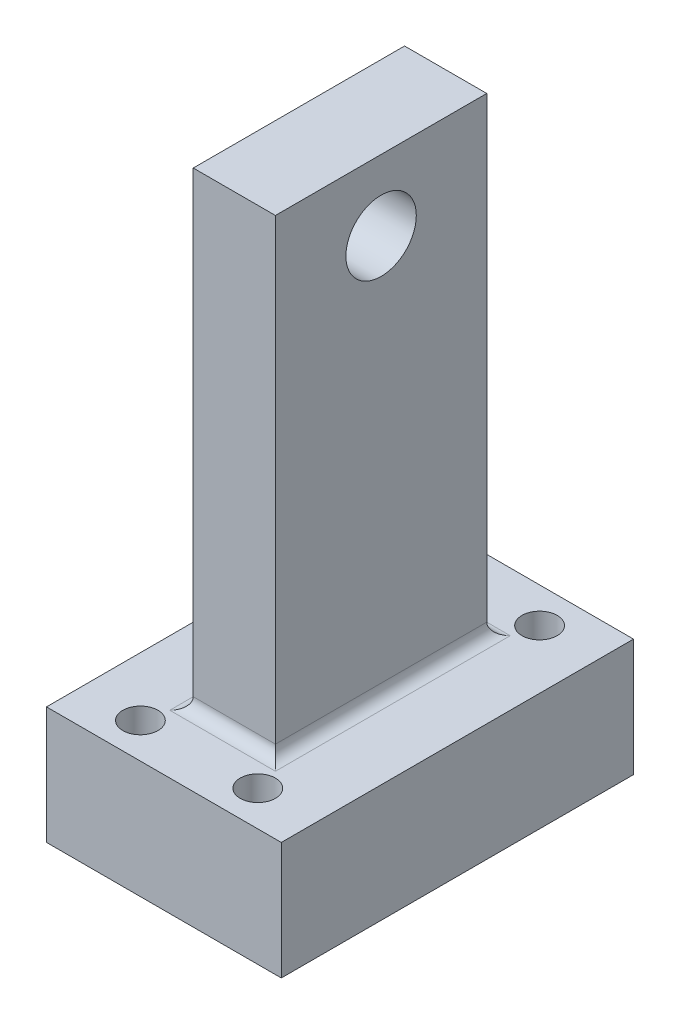
ISO-10303-21;
HEADER;
FILE_DESCRIPTION(('STEP AP214'),'2;1');
FILE_NAME('part.step','',(''),(''),'','','');
FILE_SCHEMA(('AUTOMOTIVE_DESIGN { 1 0 10303 214 1 1 1 1 }'));
ENDSEC;
DATA;
#1=APPLICATION_CONTEXT('core data for automotive mechanical design processes');
#2=APPLICATION_PROTOCOL_DEFINITION('international standard','automotive_design',2000,#1);
#3=PRODUCT_CONTEXT('',#1,'mechanical');
#4=PRODUCT('Part','Part','',(#3));
#5=PRODUCT_RELATED_PRODUCT_CATEGORY('part','',(#4));
#6=PRODUCT_DEFINITION_FORMATION('','',#4);
#7=PRODUCT_DEFINITION_CONTEXT('part definition',#1,'design');
#8=PRODUCT_DEFINITION('design','',#6,#7);
#9=PRODUCT_DEFINITION_SHAPE('','',#8);
#10=(LENGTH_UNIT() NAMED_UNIT(*) SI_UNIT(.MILLI.,.METRE.));
#11=(NAMED_UNIT(*) PLANE_ANGLE_UNIT() SI_UNIT($,.RADIAN.));
#12=(NAMED_UNIT(*) SI_UNIT($,.STERADIAN.) SOLID_ANGLE_UNIT());
#13=UNCERTAINTY_MEASURE_WITH_UNIT(LENGTH_MEASURE(1.E-05),#10,'distance_accuracy_value','');
#14=(GEOMETRIC_REPRESENTATION_CONTEXT(3) GLOBAL_UNCERTAINTY_ASSIGNED_CONTEXT((#13)) GLOBAL_UNIT_ASSIGNED_CONTEXT((#10,
#11,#12)) REPRESENTATION_CONTEXT('',''));
#15=CARTESIAN_POINT('',(0.,0.,0.));
#16=DIRECTION('',(0.,0.,1.));
#17=DIRECTION('',(1.,0.,0.));
#18=AXIS2_PLACEMENT_3D('',#15,#16,#17);
#19=CARTESIAN_POINT('',(0.,10.,0.));
#20=DIRECTION('',(0.,0.,-1.));
#21=DIRECTION('',(-1.,0.,0.));
#22=AXIS2_PLACEMENT_3D('',#19,#20,#21);
#23=PLANE('',#22);
#24=DIRECTION('',(1.,0.,0.));
#25=VECTOR('',#24,1.);
#26=CARTESIAN_POINT('',(0.,0.,0.));
#27=LINE('',#26,#25);
#28=CARTESIAN_POINT('',(0.,0.,0.));
#29=VERTEX_POINT('',#28);
#30=CARTESIAN_POINT('',(20.,0.,0.));
#31=VERTEX_POINT('',#30);
#32=EDGE_CURVE('E185',#29,#31,#27,.T.);
#33=ORIENTED_EDGE('',*,*,#32,.T.);
#34=DIRECTION('',(0.,-1.,0.));
#35=VECTOR('',#34,1.);
#36=CARTESIAN_POINT('',(20.,10.,0.));
#37=LINE('',#36,#35);
#38=CARTESIAN_POINT('',(20.,10.,0.));
#39=VERTEX_POINT('',#38);
#40=EDGE_CURVE('E201',#39,#31,#37,.T.);
#41=ORIENTED_EDGE('',*,*,#40,.F.);
#42=DIRECTION('',(1.,0.,0.));
#43=VECTOR('',#42,1.);
#44=CARTESIAN_POINT('',(0.,10.,0.));
#45=LINE('',#44,#43);
#46=CARTESIAN_POINT('',(0.,10.,0.));
#47=VERTEX_POINT('',#46);
#48=EDGE_CURVE('E165',#47,#39,#45,.T.);
#49=ORIENTED_EDGE('',*,*,#48,.F.);
#50=DIRECTION('',(0.,-1.,0.));
#51=VECTOR('',#50,1.);
#52=CARTESIAN_POINT('',(0.,10.,0.));
#53=LINE('',#52,#51);
#54=EDGE_CURVE('E175',#47,#29,#53,.T.);
#55=ORIENTED_EDGE('',*,*,#54,.T.);
#56=EDGE_LOOP('',(#33,#41,#49,#55));
#57=FACE_BOUND('',#56,.T.);
#58=ADVANCED_FACE('F41',(#57),#23,.F.);
#59=CARTESIAN_POINT('',(20.,10.,0.));
#60=DIRECTION('',(-1.,0.,0.));
#61=DIRECTION('',(0.,0.,1.));
#62=AXIS2_PLACEMENT_3D('',#59,#60,#61);
#63=PLANE('',#62);
#64=DIRECTION('',(0.,0.,-1.));
#65=VECTOR('',#64,1.);
#66=CARTESIAN_POINT('',(20.,0.,0.));
#67=LINE('',#66,#65);
#68=CARTESIAN_POINT('',(20.,0.,-30.));
#69=VERTEX_POINT('',#68);
#70=EDGE_CURVE('E188',#31,#69,#67,.T.);
#71=ORIENTED_EDGE('',*,*,#70,.T.);
#72=DIRECTION('',(0.,-1.,0.));
#73=VECTOR('',#72,1.);
#74=CARTESIAN_POINT('',(20.,10.,-30.));
#75=LINE('',#74,#73);
#76=CARTESIAN_POINT('',(20.,10.,-30.));
#77=VERTEX_POINT('',#76);
#78=EDGE_CURVE('E199',#77,#69,#75,.T.);
#79=ORIENTED_EDGE('',*,*,#78,.F.);
#80=DIRECTION('',(0.,0.,-1.));
#81=VECTOR('',#80,1.);
#82=CARTESIAN_POINT('',(20.,10.,0.));
#83=LINE('',#82,#81);
#84=EDGE_CURVE('E168',#39,#77,#83,.T.);
#85=ORIENTED_EDGE('',*,*,#84,.F.);
#86=ORIENTED_EDGE('',*,*,#40,.T.);
#87=EDGE_LOOP('',(#71,#79,#85,#86));
#88=FACE_BOUND('',#87,.T.);
#89=ADVANCED_FACE('F260',(#88),#63,.F.);
#90=CARTESIAN_POINT('',(0.,10.,-30.));
#91=DIRECTION('',(0.,0.,-1.));
#92=DIRECTION('',(-1.,0.,0.));
#93=AXIS2_PLACEMENT_3D('',#90,#91,#92);
#94=PLANE('',#93);
#95=DIRECTION('',(1.,0.,0.));
#96=VECTOR('',#95,1.);
#97=CARTESIAN_POINT('',(0.,0.,-30.));
#98=LINE('',#97,#96);
#99=CARTESIAN_POINT('',(0.,0.,-30.));
#100=VERTEX_POINT('',#99);
#101=EDGE_CURVE('E191',#100,#69,#98,.T.);
#102=ORIENTED_EDGE('',*,*,#101,.F.);
#103=DIRECTION('',(0.,-1.,0.));
#104=VECTOR('',#103,1.);
#105=CARTESIAN_POINT('',(0.,10.,-30.));
#106=LINE('',#105,#104);
#107=CARTESIAN_POINT('',(0.,10.,-30.));
#108=VERTEX_POINT('',#107);
#109=EDGE_CURVE('E197',#108,#100,#106,.T.);
#110=ORIENTED_EDGE('',*,*,#109,.F.);
#111=DIRECTION('',(1.,0.,0.));
#112=VECTOR('',#111,1.);
#113=CARTESIAN_POINT('',(0.,10.,-30.));
#114=LINE('',#113,#112);
#115=EDGE_CURVE('E170',#108,#77,#114,.T.);
#116=ORIENTED_EDGE('',*,*,#115,.T.);
#117=ORIENTED_EDGE('',*,*,#78,.T.);
#118=EDGE_LOOP('',(#102,#110,#116,#117));
#119=FACE_BOUND('',#118,.T.);
#120=ADVANCED_FACE('F266',(#119),#94,.T.);
#121=CARTESIAN_POINT('',(5.,10.,-27.));
#122=DIRECTION('',(0.,-1.,0.));
#123=DIRECTION('',(0.,0.,-1.));
#124=AXIS2_PLACEMENT_3D('',#121,#122,#123);
#125=CYLINDRICAL_SURFACE('',#124,1.5);
#126=CARTESIAN_POINT('',(5.,10.,-27.));
#127=DIRECTION('',(0.,1.,0.));
#128=DIRECTION('',(0.,0.,1.));
#129=AXIS2_PLACEMENT_3D('',#126,#127,#128);
#130=CIRCLE('',#129,1.5);
#131=CARTESIAN_POINT('',(5.,10.,-25.5));
#132=VERTEX_POINT('',#131);
#133=EDGE_CURVE('E162',#132,#132,#130,.T.);
#134=ORIENTED_EDGE('',*,*,#133,.T.);
#135=EDGE_LOOP('',(#134));
#136=FACE_BOUND('',#135,.T.);
#137=CARTESIAN_POINT('',(5.,0.,-27.));
#138=DIRECTION('',(0.,1.,0.));
#139=DIRECTION('',(0.,0.,1.));
#140=AXIS2_PLACEMENT_3D('',#137,#138,#139);
#141=CIRCLE('',#140,1.5);
#142=CARTESIAN_POINT('',(5.,0.,-25.5));
#143=VERTEX_POINT('',#142);
#144=EDGE_CURVE('E182',#143,#143,#141,.T.);
#145=ORIENTED_EDGE('',*,*,#144,.F.);
#146=EDGE_LOOP('',(#145));
#147=FACE_BOUND('',#146,.T.);
#148=ADVANCED_FACE('F271',(#136,#147),#125,.F.);
#149=CARTESIAN_POINT('',(15.,10.,-27.));
#150=DIRECTION('',(0.,-1.,0.));
#151=DIRECTION('',(0.,0.,-1.));
#152=AXIS2_PLACEMENT_3D('',#149,#150,#151);
#153=CYLINDRICAL_SURFACE('',#152,1.5);
#154=CARTESIAN_POINT('',(15.,10.,-27.));
#155=DIRECTION('',(0.,1.,0.));
#156=DIRECTION('',(0.,0.,1.));
#157=AXIS2_PLACEMENT_3D('',#154,#155,#156);
#158=CIRCLE('',#157,1.5);
#159=CARTESIAN_POINT('',(15.,10.,-25.5));
#160=VERTEX_POINT('',#159);
#161=EDGE_CURVE('E159',#160,#160,#158,.T.);
#162=ORIENTED_EDGE('',*,*,#161,.T.);
#163=EDGE_LOOP('',(#162));
#164=FACE_BOUND('',#163,.T.);
#165=CARTESIAN_POINT('',(15.,0.,-27.));
#166=DIRECTION('',(0.,1.,0.));
#167=DIRECTION('',(0.,0.,1.));
#168=AXIS2_PLACEMENT_3D('',#165,#166,#167);
#169=CIRCLE('',#168,1.5);
#170=CARTESIAN_POINT('',(15.,0.,-25.5));
#171=VERTEX_POINT('',#170);
#172=EDGE_CURVE('E179',#171,#171,#169,.T.);
#173=ORIENTED_EDGE('',*,*,#172,.F.);
#174=EDGE_LOOP('',(#173));
#175=FACE_BOUND('',#174,.T.);
#176=ADVANCED_FACE('F274',(#164,#175),#153,.F.);
#177=CARTESIAN_POINT('',(5.,10.,-3.));
#178=DIRECTION('',(0.,-1.,0.));
#179=DIRECTION('',(0.,0.,-1.));
#180=AXIS2_PLACEMENT_3D('',#177,#178,#179);
#181=CYLINDRICAL_SURFACE('',#180,1.5);
#182=CARTESIAN_POINT('',(5.,10.,-3.));
#183=DIRECTION('',(0.,1.,0.));
#184=DIRECTION('',(0.,0.,1.));
#185=AXIS2_PLACEMENT_3D('',#182,#183,#184);
#186=CIRCLE('',#185,1.5);
#187=CARTESIAN_POINT('',(5.,10.,-1.5));
#188=VERTEX_POINT('',#187);
#189=EDGE_CURVE('E155',#188,#188,#186,.T.);
#190=ORIENTED_EDGE('',*,*,#189,.T.);
#191=EDGE_LOOP('',(#190));
#192=FACE_BOUND('',#191,.T.);
#193=CARTESIAN_POINT('',(5.,0.,-3.));
#194=DIRECTION('',(0.,1.,0.));
#195=DIRECTION('',(0.,0.,1.));
#196=AXIS2_PLACEMENT_3D('',#193,#194,#195);
#197=CIRCLE('',#196,1.5);
#198=CARTESIAN_POINT('',(5.,0.,-1.5));
#199=VERTEX_POINT('',#198);
#200=EDGE_CURVE('E146',#199,#199,#197,.T.);
#201=ORIENTED_EDGE('',*,*,#200,.F.);
#202=EDGE_LOOP('',(#201));
#203=FACE_BOUND('',#202,.T.);
#204=ADVANCED_FACE('F278',(#192,#203),#181,.F.);
#205=CARTESIAN_POINT('',(15.,10.,-3.));
#206=DIRECTION('',(0.,-1.,0.));
#207=DIRECTION('',(0.,0.,-1.));
#208=AXIS2_PLACEMENT_3D('',#205,#206,#207);
#209=CYLINDRICAL_SURFACE('',#208,1.5);
#210=CARTESIAN_POINT('',(15.,10.,-3.));
#211=DIRECTION('',(0.,1.,0.));
#212=DIRECTION('',(0.,0.,1.));
#213=AXIS2_PLACEMENT_3D('',#210,#211,#212);
#214=CIRCLE('',#213,1.5);
#215=CARTESIAN_POINT('',(15.,10.,-1.5));
#216=VERTEX_POINT('',#215);
#217=EDGE_CURVE('E152',#216,#216,#214,.T.);
#218=ORIENTED_EDGE('',*,*,#217,.T.);
#219=EDGE_LOOP('',(#218));
#220=FACE_BOUND('',#219,.T.);
#221=CARTESIAN_POINT('',(15.,0.,-3.));
#222=DIRECTION('',(0.,1.,0.));
#223=DIRECTION('',(0.,0.,1.));
#224=AXIS2_PLACEMENT_3D('',#221,#222,#223);
#225=CIRCLE('',#224,1.5);
#226=CARTESIAN_POINT('',(15.,0.,-1.5));
#227=VERTEX_POINT('',#226);
#228=EDGE_CURVE('E143',#227,#227,#225,.T.);
#229=ORIENTED_EDGE('',*,*,#228,.F.);
#230=EDGE_LOOP('',(#229));
#231=FACE_BOUND('',#230,.T.);
#232=ADVANCED_FACE('F282',(#220,#231),#209,.F.);
#233=CARTESIAN_POINT('',(0.,10.,0.));
#234=DIRECTION('',(-1.,0.,0.));
#235=DIRECTION('',(0.,0.,1.));
#236=AXIS2_PLACEMENT_3D('',#233,#234,#235);
#237=PLANE('',#236);
#238=DIRECTION('',(0.,0.,-1.));
#239=VECTOR('',#238,1.);
#240=CARTESIAN_POINT('',(0.,0.,0.));
#241=LINE('',#240,#239);
#242=EDGE_CURVE('E156',#29,#100,#241,.T.);
#243=ORIENTED_EDGE('',*,*,#242,.F.);
#244=ORIENTED_EDGE('',*,*,#54,.F.);
#245=DIRECTION('',(0.,0.,-1.));
#246=VECTOR('',#245,1.);
#247=CARTESIAN_POINT('',(0.,10.,0.));
#248=LINE('',#247,#246);
#249=EDGE_CURVE('E173',#47,#108,#248,.T.);
#250=ORIENTED_EDGE('',*,*,#249,.T.);
#251=ORIENTED_EDGE('',*,*,#109,.T.);
#252=EDGE_LOOP('',(#243,#244,#250,#251));
#253=FACE_BOUND('',#252,.T.);
#254=ADVANCED_FACE('F286',(#253),#237,.T.);
#255=CARTESIAN_POINT('',(0.,10.,0.));
#256=DIRECTION('',(0.,1.,0.));
#257=DIRECTION('',(0.,0.,1.));
#258=AXIS2_PLACEMENT_3D('',#255,#256,#257);
#259=PLANE('',#258);
#260=DIRECTION('',(0.,0.,1.));
#261=VECTOR('',#260,1.);
#262=CARTESIAN_POINT('',(5.5,10.,0.));
#263=LINE('',#262,#261);
#264=CARTESIAN_POINT('',(5.5,10.,-5.00000000000001));
#265=VERTEX_POINT('',#264);
#266=CARTESIAN_POINT('',(5.5,10.,-25.));
#267=VERTEX_POINT('',#266);
#268=EDGE_CURVE('E213',#265,#267,#263,.F.);
#269=ORIENTED_EDGE('',*,*,#268,.T.);
#270=DIRECTION('',(-1.,0.,0.));
#271=VECTOR('',#270,1.);
#272=CARTESIAN_POINT('',(0.,10.,-25.));
#273=LINE('',#272,#271);
#274=CARTESIAN_POINT('',(14.5,10.,-25.));
#275=VERTEX_POINT('',#274);
#276=EDGE_CURVE('E215',#267,#275,#273,.F.);
#277=ORIENTED_EDGE('',*,*,#276,.T.);
#278=DIRECTION('',(0.,0.,-1.));
#279=VECTOR('',#278,1.);
#280=CARTESIAN_POINT('',(14.5,10.,0.));
#281=LINE('',#280,#279);
#282=CARTESIAN_POINT('',(14.5,10.,-5.00000000000001));
#283=VERTEX_POINT('',#282);
#284=EDGE_CURVE('E211',#275,#283,#281,.F.);
#285=ORIENTED_EDGE('',*,*,#284,.T.);
#286=DIRECTION('',(1.,0.,0.));
#287=VECTOR('',#286,1.);
#288=CARTESIAN_POINT('',(0.,10.,-5.00000000000001));
#289=LINE('',#288,#287);
#290=EDGE_CURVE('E209',#283,#265,#289,.F.);
#291=ORIENTED_EDGE('',*,*,#290,.T.);
#292=EDGE_LOOP('',(#269,#277,#285,#291));
#293=FACE_BOUND('',#292,.T.);
#294=ORIENTED_EDGE('',*,*,#217,.F.);
#295=EDGE_LOOP('',(#294));
#296=FACE_BOUND('',#295,.T.);
#297=ORIENTED_EDGE('',*,*,#189,.F.);
#298=EDGE_LOOP('',(#297));
#299=FACE_BOUND('',#298,.T.);
#300=ORIENTED_EDGE('',*,*,#161,.F.);
#301=EDGE_LOOP('',(#300));
#302=FACE_BOUND('',#301,.T.);
#303=ORIENTED_EDGE('',*,*,#133,.F.);
#304=EDGE_LOOP('',(#303));
#305=FACE_BOUND('',#304,.T.);
#306=ORIENTED_EDGE('',*,*,#48,.T.);
#307=ORIENTED_EDGE('',*,*,#84,.T.);
#308=ORIENTED_EDGE('',*,*,#115,.F.);
#309=ORIENTED_EDGE('',*,*,#249,.F.);
#310=EDGE_LOOP('',(#306,#307,#308,#309));
#311=FACE_BOUND('',#310,.T.);
#312=ADVANCED_FACE('F384',(#293,#296,#299,#302,#305,#311),#259,.T.);
#313=CARTESIAN_POINT('',(0.,0.,0.));
#314=DIRECTION('',(0.,1.,0.));
#315=DIRECTION('',(0.,0.,1.));
#316=AXIS2_PLACEMENT_3D('',#313,#314,#315);
#317=PLANE('',#316);
#318=ORIENTED_EDGE('',*,*,#228,.T.);
#319=EDGE_LOOP('',(#318));
#320=FACE_BOUND('',#319,.T.);
#321=ORIENTED_EDGE('',*,*,#200,.T.);
#322=EDGE_LOOP('',(#321));
#323=FACE_BOUND('',#322,.T.);
#324=ORIENTED_EDGE('',*,*,#172,.T.);
#325=EDGE_LOOP('',(#324));
#326=FACE_BOUND('',#325,.T.);
#327=ORIENTED_EDGE('',*,*,#144,.T.);
#328=EDGE_LOOP('',(#327));
#329=FACE_BOUND('',#328,.T.);
#330=ORIENTED_EDGE('',*,*,#32,.F.);
#331=ORIENTED_EDGE('',*,*,#242,.T.);
#332=ORIENTED_EDGE('',*,*,#101,.T.);
#333=ORIENTED_EDGE('',*,*,#70,.F.);
#334=EDGE_LOOP('',(#330,#331,#332,#333));
#335=FACE_BOUND('',#334,.T.);
#336=ADVANCED_FACE('F374',(#320,#323,#326,#329,#335),#317,.F.);
#337=CARTESIAN_POINT('',(13.5,50.,-6.00000000000001));
#338=DIRECTION('',(-1.,0.,0.));
#339=DIRECTION('',(0.,0.,1.));
#340=AXIS2_PLACEMENT_3D('',#337,#338,#339);
#341=PLANE('',#340);
#342=CARTESIAN_POINT('',(13.5,44.,-15.));
#343=DIRECTION('',(1.,0.,0.));
#344=DIRECTION('',(0.,0.,-1.));
#345=AXIS2_PLACEMENT_3D('',#342,#343,#344);
#346=CIRCLE('',#345,3.);
#347=CARTESIAN_POINT('',(13.5,44.,-18.));
#348=VERTEX_POINT('',#347);
#349=EDGE_CURVE('E207',#348,#348,#346,.T.);
#350=ORIENTED_EDGE('',*,*,#349,.F.);
#351=EDGE_LOOP('',(#350));
#352=FACE_BOUND('',#351,.T.);
#353=DIRECTION('',(0.,-1.,0.));
#354=VECTOR('',#353,1.);
#355=CARTESIAN_POINT('',(13.5,50.,-6.00000000000001));
#356=LINE('',#355,#354);
#357=CARTESIAN_POINT('',(13.5,50.,-6.00000000000001));
#358=VERTEX_POINT('',#357);
#359=CARTESIAN_POINT('',(13.5,11.,-6.00000000000001));
#360=VERTEX_POINT('',#359);
#361=EDGE_CURVE('E239',#358,#360,#356,.T.);
#362=ORIENTED_EDGE('',*,*,#361,.T.);
#363=DIRECTION('',(0.,0.,-1.));
#364=VECTOR('',#363,1.);
#365=CARTESIAN_POINT('',(13.5,11.,-6.00000000000001));
#366=LINE('',#365,#364);
#367=CARTESIAN_POINT('',(13.5,11.,-24.));
#368=VERTEX_POINT('',#367);
#369=EDGE_CURVE('E50',#360,#368,#366,.T.);
#370=ORIENTED_EDGE('',*,*,#369,.T.);
#371=DIRECTION('',(0.,-1.,0.));
#372=VECTOR('',#371,1.);
#373=CARTESIAN_POINT('',(13.5,50.,-24.));
#374=LINE('',#373,#372);
#375=CARTESIAN_POINT('',(13.5,50.,-24.));
#376=VERTEX_POINT('',#375);
#377=EDGE_CURVE('E126',#376,#368,#374,.T.);
#378=ORIENTED_EDGE('',*,*,#377,.F.);
#379=DIRECTION('',(0.,0.,-1.));
#380=VECTOR('',#379,1.);
#381=CARTESIAN_POINT('',(13.5,50.,-6.00000000000001));
#382=LINE('',#381,#380);
#383=EDGE_CURVE('E132',#358,#376,#382,.T.);
#384=ORIENTED_EDGE('',*,*,#383,.F.);
#385=EDGE_LOOP('',(#362,#370,#378,#384));
#386=FACE_BOUND('',#385,.T.);
#387=ADVANCED_FACE('F141',(#352,#386),#341,.F.);
#388=CARTESIAN_POINT('',(6.5,50.,-24.));
#389=DIRECTION('',(0.,0.,1.));
#390=DIRECTION('',(1.,0.,0.));
#391=AXIS2_PLACEMENT_3D('',#388,#389,#390);
#392=PLANE('',#391);
#393=ORIENTED_EDGE('',*,*,#377,.T.);
#394=DIRECTION('',(-1.,0.,0.));
#395=VECTOR('',#394,1.);
#396=CARTESIAN_POINT('',(6.5,11.,-24.));
#397=LINE('',#396,#395);
#398=CARTESIAN_POINT('',(6.5,11.,-24.));
#399=VERTEX_POINT('',#398);
#400=EDGE_CURVE('E204',#368,#399,#397,.T.);
#401=ORIENTED_EDGE('',*,*,#400,.T.);
#402=DIRECTION('',(0.,-1.,0.));
#403=VECTOR('',#402,1.);
#404=CARTESIAN_POINT('',(6.5,50.,-24.));
#405=LINE('',#404,#403);
#406=CARTESIAN_POINT('',(6.5,50.,-24.));
#407=VERTEX_POINT('',#406);
#408=EDGE_CURVE('E128',#407,#399,#405,.T.);
#409=ORIENTED_EDGE('',*,*,#408,.F.);
#410=DIRECTION('',(-1.,0.,0.));
#411=VECTOR('',#410,1.);
#412=CARTESIAN_POINT('',(6.5,50.,-24.));
#413=LINE('',#412,#411);
#414=EDGE_CURVE('E121',#376,#407,#413,.T.);
#415=ORIENTED_EDGE('',*,*,#414,.F.);
#416=EDGE_LOOP('',(#393,#401,#409,#415));
#417=FACE_BOUND('',#416,.T.);
#418=ADVANCED_FACE('F123',(#417),#392,.F.);
#419=CARTESIAN_POINT('',(6.5,50.,-6.00000000000001));
#420=DIRECTION('',(1.,0.,0.));
#421=DIRECTION('',(0.,0.,-1.));
#422=AXIS2_PLACEMENT_3D('',#419,#420,#421);
#423=PLANE('',#422);
#424=CARTESIAN_POINT('',(6.5,44.,-15.));
#425=DIRECTION('',(1.,0.,0.));
#426=DIRECTION('',(0.,0.,-1.));
#427=AXIS2_PLACEMENT_3D('',#424,#425,#426);
#428=CIRCLE('',#427,3.);
#429=CARTESIAN_POINT('',(6.5,44.,-18.));
#430=VERTEX_POINT('',#429);
#431=EDGE_CURVE('E139',#430,#430,#428,.T.);
#432=ORIENTED_EDGE('',*,*,#431,.T.);
#433=EDGE_LOOP('',(#432));
#434=FACE_BOUND('',#433,.T.);
#435=ORIENTED_EDGE('',*,*,#408,.T.);
#436=DIRECTION('',(0.,0.,1.));
#437=VECTOR('',#436,1.);
#438=CARTESIAN_POINT('',(6.5,11.,-6.00000000000001));
#439=LINE('',#438,#437);
#440=CARTESIAN_POINT('',(6.5,11.,-6.00000000000001));
#441=VERTEX_POINT('',#440);
#442=EDGE_CURVE('E64',#399,#441,#439,.T.);
#443=ORIENTED_EDGE('',*,*,#442,.T.);
#444=DIRECTION('',(0.,-1.,0.));
#445=VECTOR('',#444,1.);
#446=CARTESIAN_POINT('',(6.5,50.,-6.00000000000001));
#447=LINE('',#446,#445);
#448=CARTESIAN_POINT('',(6.5,50.,-6.00000000000001));
#449=VERTEX_POINT('',#448);
#450=EDGE_CURVE('E148',#449,#441,#447,.T.);
#451=ORIENTED_EDGE('',*,*,#450,.F.);
#452=DIRECTION('',(0.,0.,1.));
#453=VECTOR('',#452,1.);
#454=CARTESIAN_POINT('',(6.5,50.,-6.00000000000001));
#455=LINE('',#454,#453);
#456=EDGE_CURVE('E131',#407,#449,#455,.T.);
#457=ORIENTED_EDGE('',*,*,#456,.F.);
#458=EDGE_LOOP('',(#435,#443,#451,#457));
#459=FACE_BOUND('',#458,.T.);
#460=ADVANCED_FACE('F249',(#434,#459),#423,.F.);
#461=CARTESIAN_POINT('',(6.5,50.,-6.00000000000001));
#462=DIRECTION('',(0.,0.,-1.));
#463=DIRECTION('',(-1.,0.,0.));
#464=AXIS2_PLACEMENT_3D('',#461,#462,#463);
#465=PLANE('',#464);
#466=ORIENTED_EDGE('',*,*,#450,.T.);
#467=DIRECTION('',(1.,0.,0.));
#468=VECTOR('',#467,1.);
#469=CARTESIAN_POINT('',(6.5,11.,-6.00000000000001));
#470=LINE('',#469,#468);
#471=EDGE_CURVE('E11',#441,#360,#470,.T.);
#472=ORIENTED_EDGE('',*,*,#471,.T.);
#473=ORIENTED_EDGE('',*,*,#361,.F.);
#474=DIRECTION('',(1.,0.,0.));
#475=VECTOR('',#474,1.);
#476=CARTESIAN_POINT('',(6.5,50.,-6.00000000000001));
#477=LINE('',#476,#475);
#478=EDGE_CURVE('E137',#449,#358,#477,.T.);
#479=ORIENTED_EDGE('',*,*,#478,.F.);
#480=EDGE_LOOP('',(#466,#472,#473,#479));
#481=FACE_BOUND('',#480,.T.);
#482=ADVANCED_FACE('F240',(#481),#465,.F.);
#483=CARTESIAN_POINT('',(0.,50.,0.));
#484=DIRECTION('',(0.,-1.,0.));
#485=DIRECTION('',(0.,0.,-1.));
#486=AXIS2_PLACEMENT_3D('',#483,#484,#485);
#487=PLANE('',#486);
#488=ORIENTED_EDGE('',*,*,#383,.T.);
#489=ORIENTED_EDGE('',*,*,#414,.T.);
#490=ORIENTED_EDGE('',*,*,#456,.T.);
#491=ORIENTED_EDGE('',*,*,#478,.T.);
#492=EDGE_LOOP('',(#488,#489,#490,#491));
#493=FACE_BOUND('',#492,.T.);
#494=ADVANCED_FACE('F135',(#493),#487,.F.);
#495=CARTESIAN_POINT('',(-26.5,44.,-15.));
#496=DIRECTION('',(1.,0.,0.));
#497=DIRECTION('',(0.,0.,-1.));
#498=AXIS2_PLACEMENT_3D('',#495,#496,#497);
#499=CYLINDRICAL_SURFACE('',#498,3.);
#500=ORIENTED_EDGE('',*,*,#349,.T.);
#501=EDGE_LOOP('',(#500));
#502=FACE_BOUND('',#501,.T.);
#503=ORIENTED_EDGE('',*,*,#431,.F.);
#504=EDGE_LOOP('',(#503));
#505=FACE_BOUND('',#504,.T.);
#506=ADVANCED_FACE('F296',(#502,#505),#499,.F.);
#507=CARTESIAN_POINT('',(6.5,11.,-5.00000000000001));
#508=DIRECTION('',(1.,0.,0.));
#509=DIRECTION('',(0.,0.,-1.));
#510=AXIS2_PLACEMENT_3D('',#507,#508,#509);
#511=CYLINDRICAL_SURFACE('',#510,1.);
#512=CARTESIAN_POINT('',(5.5,11.,-5.00000000000001));
#513=DIRECTION('',(0.707106781186547,0.,0.707106781186547));
#514=DIRECTION('',(0.707106781186547,0.,-0.707106781186547));
#515=AXIS2_PLACEMENT_3D('',#512,#513,#514);
#516=ELLIPSE('',#515,1.41421356237309,1.);
#517=EDGE_CURVE('E223',#265,#441,#516,.T.);
#518=ORIENTED_EDGE('',*,*,#517,.F.);
#519=ORIENTED_EDGE('',*,*,#290,.F.);
#520=CARTESIAN_POINT('',(14.5,11.,-5.00000000000001));
#521=DIRECTION('',(0.707106781186547,0.,-0.707106781186547));
#522=DIRECTION('',(0.707106781186547,0.,0.707106781186547));
#523=AXIS2_PLACEMENT_3D('',#520,#521,#522);
#524=ELLIPSE('',#523,1.41421356237309,1.);
#525=EDGE_CURVE('E45',#360,#283,#524,.F.);
#526=ORIENTED_EDGE('',*,*,#525,.F.);
#527=ORIENTED_EDGE('',*,*,#471,.F.);
#528=EDGE_LOOP('',(#518,#519,#526,#527));
#529=FACE_BOUND('',#528,.T.);
#530=ADVANCED_FACE('F43',(#529),#511,.F.);
#531=CARTESIAN_POINT('',(14.5,11.,-6.00000000000001));
#532=DIRECTION('',(0.,0.,-1.));
#533=DIRECTION('',(-1.,0.,0.));
#534=AXIS2_PLACEMENT_3D('',#531,#532,#533);
#535=CYLINDRICAL_SURFACE('',#534,1.);
#536=ORIENTED_EDGE('',*,*,#525,.T.);
#537=ORIENTED_EDGE('',*,*,#284,.F.);
#538=CARTESIAN_POINT('',(14.5,11.,-25.));
#539=DIRECTION('',(-0.707106781186547,0.,-0.707106781186547));
#540=DIRECTION('',(0.707106781186547,0.,-0.707106781186547));
#541=AXIS2_PLACEMENT_3D('',#538,#539,#540);
#542=ELLIPSE('',#541,1.41421356237309,1.);
#543=EDGE_CURVE('E222',#368,#275,#542,.F.);
#544=ORIENTED_EDGE('',*,*,#543,.F.);
#545=ORIENTED_EDGE('',*,*,#369,.F.);
#546=EDGE_LOOP('',(#536,#537,#544,#545));
#547=FACE_BOUND('',#546,.T.);
#548=ADVANCED_FACE('F243',(#547),#535,.F.);
#549=CARTESIAN_POINT('',(5.5,11.,-6.00000000000001));
#550=DIRECTION('',(0.,0.,1.));
#551=DIRECTION('',(1.,0.,0.));
#552=AXIS2_PLACEMENT_3D('',#549,#550,#551);
#553=CYLINDRICAL_SURFACE('',#552,1.);
#554=ORIENTED_EDGE('',*,*,#517,.T.);
#555=ORIENTED_EDGE('',*,*,#442,.F.);
#556=CARTESIAN_POINT('',(5.5,11.,-25.));
#557=DIRECTION('',(-0.707106781186547,0.,0.707106781186547));
#558=DIRECTION('',(0.707106781186547,0.,0.707106781186547));
#559=AXIS2_PLACEMENT_3D('',#556,#557,#558);
#560=ELLIPSE('',#559,1.41421356237309,1.);
#561=EDGE_CURVE('E220',#267,#399,#560,.T.);
#562=ORIENTED_EDGE('',*,*,#561,.F.);
#563=ORIENTED_EDGE('',*,*,#268,.F.);
#564=EDGE_LOOP('',(#554,#555,#562,#563));
#565=FACE_BOUND('',#564,.T.);
#566=ADVANCED_FACE('F290',(#565),#553,.F.);
#567=CARTESIAN_POINT('',(6.5,11.,-25.));
#568=DIRECTION('',(-1.,0.,0.));
#569=DIRECTION('',(0.,0.,1.));
#570=AXIS2_PLACEMENT_3D('',#567,#568,#569);
#571=CYLINDRICAL_SURFACE('',#570,1.);
#572=ORIENTED_EDGE('',*,*,#543,.T.);
#573=ORIENTED_EDGE('',*,*,#276,.F.);
#574=ORIENTED_EDGE('',*,*,#561,.T.);
#575=ORIENTED_EDGE('',*,*,#400,.F.);
#576=EDGE_LOOP('',(#572,#573,#574,#575));
#577=FACE_BOUND('',#576,.T.);
#578=ADVANCED_FACE('F247',(#577),#571,.F.);
#579=CLOSED_SHELL('',(#58,#89,#120,#148,#176,#204,#232,#254,#312,#336,#387,#418,#460,#482,#494,
#506,#530,#548,#566,#578));
#580=MANIFOLD_SOLID_BREP('B2',#579);
#581=ADVANCED_BREP_SHAPE_REPRESENTATION('',(#18,#580),#14);
#582=SHAPE_DEFINITION_REPRESENTATION(#9,#581);
ENDSEC;
END-ISO-10303-21;
